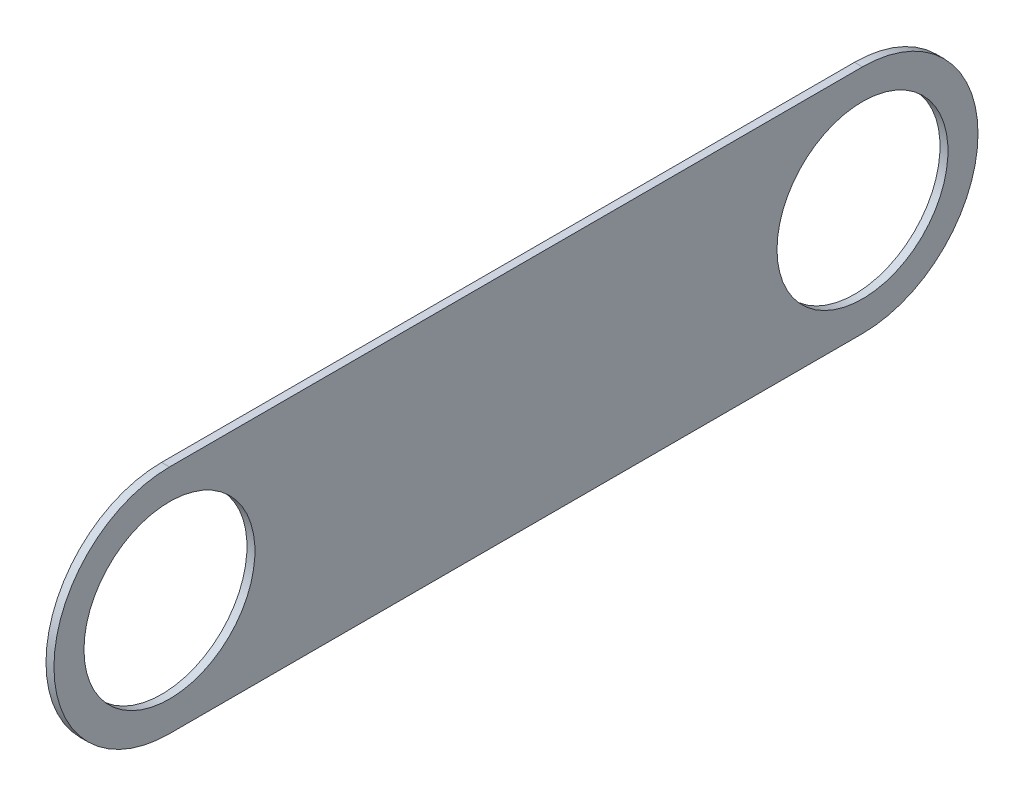
ISO-10303-21;
HEADER;
FILE_DESCRIPTION(('STEP AP214'),'2;1');
FILE_NAME('part.step','',(''),(''),'','','');
FILE_SCHEMA(('AUTOMOTIVE_DESIGN { 1 0 10303 214 1 1 1 1 }'));
ENDSEC;
DATA;
#1=APPLICATION_CONTEXT('core data for automotive mechanical design processes');
#2=APPLICATION_PROTOCOL_DEFINITION('international standard','automotive_design',2000,#1);
#3=PRODUCT_CONTEXT('',#1,'mechanical');
#4=PRODUCT('Part','Part','',(#3));
#5=PRODUCT_RELATED_PRODUCT_CATEGORY('part','',(#4));
#6=PRODUCT_DEFINITION_FORMATION('','',#4);
#7=PRODUCT_DEFINITION_CONTEXT('part definition',#1,'design');
#8=PRODUCT_DEFINITION('design','',#6,#7);
#9=PRODUCT_DEFINITION_SHAPE('','',#8);
#10=(LENGTH_UNIT() NAMED_UNIT(*) SI_UNIT(.MILLI.,.METRE.));
#11=(NAMED_UNIT(*) PLANE_ANGLE_UNIT() SI_UNIT($,.RADIAN.));
#12=(NAMED_UNIT(*) SI_UNIT($,.STERADIAN.) SOLID_ANGLE_UNIT());
#13=UNCERTAINTY_MEASURE_WITH_UNIT(LENGTH_MEASURE(1.E-05),#10,'distance_accuracy_value','');
#14=(GEOMETRIC_REPRESENTATION_CONTEXT(3) GLOBAL_UNCERTAINTY_ASSIGNED_CONTEXT((#13)) GLOBAL_UNIT_ASSIGNED_CONTEXT((#10,
#11,#12)) REPRESENTATION_CONTEXT('',''));
#15=CARTESIAN_POINT('',(0.,0.,0.));
#16=DIRECTION('',(0.,0.,1.));
#17=DIRECTION('',(1.,0.,0.));
#18=AXIS2_PLACEMENT_3D('',#15,#16,#17);
#19=CARTESIAN_POINT('',(0.87376,12.7,0.));
#20=DIRECTION('',(-1.,0.,0.));
#21=DIRECTION('',(0.,0.,1.));
#22=AXIS2_PLACEMENT_3D('',#19,#20,#21);
#23=CYLINDRICAL_SURFACE('',#22,12.7);
#24=CARTESIAN_POINT('',(0.,12.7,0.));
#25=DIRECTION('',(1.,0.,0.));
#26=DIRECTION('',(0.,0.,-1.));
#27=AXIS2_PLACEMENT_3D('',#24,#25,#26);
#28=CIRCLE('',#27,12.7);
#29=CARTESIAN_POINT('',(0.,0.,0.));
#30=VERTEX_POINT('',#29);
#31=CARTESIAN_POINT('',(0.,25.4,0.));
#32=VERTEX_POINT('',#31);
#33=EDGE_CURVE('E114',#30,#32,#28,.T.);
#34=ORIENTED_EDGE('',*,*,#33,.T.);
#35=DIRECTION('',(-1.,0.,0.));
#36=VECTOR('',#35,1.);
#37=CARTESIAN_POINT('',(0.87376,25.4,0.));
#38=LINE('',#37,#36);
#39=CARTESIAN_POINT('',(0.87376,25.4,0.));
#40=VERTEX_POINT('',#39);
#41=EDGE_CURVE('E11',#40,#32,#38,.T.);
#42=ORIENTED_EDGE('',*,*,#41,.F.);
#43=CARTESIAN_POINT('',(0.87376,12.7,0.));
#44=DIRECTION('',(1.,0.,0.));
#45=DIRECTION('',(0.,0.,-1.));
#46=AXIS2_PLACEMENT_3D('',#43,#44,#45);
#47=CIRCLE('',#46,12.7);
#48=CARTESIAN_POINT('',(0.87376,0.,0.));
#49=VERTEX_POINT('',#48);
#50=EDGE_CURVE('E100',#49,#40,#47,.T.);
#51=ORIENTED_EDGE('',*,*,#50,.F.);
#52=DIRECTION('',(-1.,0.,0.));
#53=VECTOR('',#52,1.);
#54=CARTESIAN_POINT('',(0.87376,0.,0.));
#55=LINE('',#54,#53);
#56=EDGE_CURVE('E108',#49,#30,#55,.T.);
#57=ORIENTED_EDGE('',*,*,#56,.T.);
#58=EDGE_LOOP('',(#34,#42,#51,#57));
#59=FACE_BOUND('',#58,.T.);
#60=ADVANCED_FACE('F44',(#59),#23,.T.);
#61=CARTESIAN_POINT('',(0.87376,25.4,76.2));
#62=DIRECTION('',(0.,-1.,0.));
#63=DIRECTION('',(0.,0.,-1.));
#64=AXIS2_PLACEMENT_3D('',#61,#62,#63);
#65=PLANE('',#64);
#66=DIRECTION('',(0.,0.,1.));
#67=VECTOR('',#66,1.);
#68=CARTESIAN_POINT('',(0.,25.4,76.2));
#69=LINE('',#68,#67);
#70=CARTESIAN_POINT('',(0.,25.4,76.2));
#71=VERTEX_POINT('',#70);
#72=EDGE_CURVE('E105',#32,#71,#69,.T.);
#73=ORIENTED_EDGE('',*,*,#72,.T.);
#74=DIRECTION('',(-1.,0.,0.));
#75=VECTOR('',#74,1.);
#76=CARTESIAN_POINT('',(0.87376,25.4,76.2));
#77=LINE('',#76,#75);
#78=CARTESIAN_POINT('',(0.87376,25.4,76.2));
#79=VERTEX_POINT('',#78);
#80=EDGE_CURVE('E53',#79,#71,#77,.T.);
#81=ORIENTED_EDGE('',*,*,#80,.F.);
#82=DIRECTION('',(0.,0.,1.));
#83=VECTOR('',#82,1.);
#84=CARTESIAN_POINT('',(0.87376,25.4,76.2));
#85=LINE('',#84,#83);
#86=EDGE_CURVE('E95',#40,#79,#85,.T.);
#87=ORIENTED_EDGE('',*,*,#86,.F.);
#88=ORIENTED_EDGE('',*,*,#41,.T.);
#89=EDGE_LOOP('',(#73,#81,#87,#88));
#90=FACE_BOUND('',#89,.T.);
#91=ADVANCED_FACE('F101',(#90),#65,.F.);
#92=CARTESIAN_POINT('',(0.87376,12.7,76.2));
#93=DIRECTION('',(-1.,0.,0.));
#94=DIRECTION('',(0.,0.,1.));
#95=AXIS2_PLACEMENT_3D('',#92,#93,#94);
#96=CYLINDRICAL_SURFACE('',#95,12.7);
#97=CARTESIAN_POINT('',(0.,12.7,76.2));
#98=DIRECTION('',(1.,0.,0.));
#99=DIRECTION('',(0.,0.,-1.));
#100=AXIS2_PLACEMENT_3D('',#97,#98,#99);
#101=CIRCLE('',#100,12.7);
#102=CARTESIAN_POINT('',(0.,0.,76.2));
#103=VERTEX_POINT('',#102);
#104=EDGE_CURVE('E76',#71,#103,#101,.T.);
#105=ORIENTED_EDGE('',*,*,#104,.T.);
#106=DIRECTION('',(-1.,0.,0.));
#107=VECTOR('',#106,1.);
#108=CARTESIAN_POINT('',(0.87376,0.,76.2));
#109=LINE('',#108,#107);
#110=CARTESIAN_POINT('',(0.87376,0.,76.2));
#111=VERTEX_POINT('',#110);
#112=EDGE_CURVE('E102',#111,#103,#109,.T.);
#113=ORIENTED_EDGE('',*,*,#112,.F.);
#114=CARTESIAN_POINT('',(0.87376,12.7,76.2));
#115=DIRECTION('',(1.,0.,0.));
#116=DIRECTION('',(0.,0.,-1.));
#117=AXIS2_PLACEMENT_3D('',#114,#115,#116);
#118=CIRCLE('',#117,12.7);
#119=EDGE_CURVE('E92',#79,#111,#118,.T.);
#120=ORIENTED_EDGE('',*,*,#119,.F.);
#121=ORIENTED_EDGE('',*,*,#80,.T.);
#122=EDGE_LOOP('',(#105,#113,#120,#121));
#123=FACE_BOUND('',#122,.T.);
#124=ADVANCED_FACE('F104',(#123),#96,.T.);
#125=CARTESIAN_POINT('',(0.87376,0.,0.));
#126=DIRECTION('',(0.,1.,0.));
#127=DIRECTION('',(0.,0.,1.));
#128=AXIS2_PLACEMENT_3D('',#125,#126,#127);
#129=PLANE('',#128);
#130=DIRECTION('',(0.,0.,-1.));
#131=VECTOR('',#130,1.);
#132=CARTESIAN_POINT('',(0.,0.,0.));
#133=LINE('',#132,#131);
#134=EDGE_CURVE('E81',#103,#30,#133,.T.);
#135=ORIENTED_EDGE('',*,*,#134,.T.);
#136=ORIENTED_EDGE('',*,*,#56,.F.);
#137=DIRECTION('',(0.,0.,-1.));
#138=VECTOR('',#137,1.);
#139=CARTESIAN_POINT('',(0.87376,0.,0.));
#140=LINE('',#139,#138);
#141=EDGE_CURVE('E65',#111,#49,#140,.T.);
#142=ORIENTED_EDGE('',*,*,#141,.F.);
#143=ORIENTED_EDGE('',*,*,#112,.T.);
#144=EDGE_LOOP('',(#135,#136,#142,#143));
#145=FACE_BOUND('',#144,.T.);
#146=ADVANCED_FACE('F130',(#145),#129,.F.);
#147=CARTESIAN_POINT('',(0.87376,12.7,0.));
#148=DIRECTION('',(1.,0.,0.));
#149=DIRECTION('',(0.,0.,-1.));
#150=AXIS2_PLACEMENT_3D('',#147,#148,#149);
#151=PLANE('',#150);
#152=CARTESIAN_POINT('',(0.87376,12.7,76.2));
#153=DIRECTION('',(1.,0.,0.));
#154=DIRECTION('',(0.,0.,-1.));
#155=AXIS2_PLACEMENT_3D('',#152,#153,#154);
#156=CIRCLE('',#155,9.39799999999999);
#157=CARTESIAN_POINT('',(0.87376,12.7,85.598));
#158=VERTEX_POINT('',#157);
#159=EDGE_CURVE('E120',#158,#158,#156,.T.);
#160=ORIENTED_EDGE('',*,*,#159,.F.);
#161=EDGE_LOOP('',(#160));
#162=FACE_BOUND('',#161,.T.);
#163=CARTESIAN_POINT('',(0.87376,12.7,0.));
#164=DIRECTION('',(1.,0.,0.));
#165=DIRECTION('',(0.,0.,-1.));
#166=AXIS2_PLACEMENT_3D('',#163,#164,#165);
#167=CIRCLE('',#166,9.398);
#168=CARTESIAN_POINT('',(0.87376,12.7,9.398));
#169=VERTEX_POINT('',#168);
#170=EDGE_CURVE('E131',#169,#169,#167,.T.);
#171=ORIENTED_EDGE('',*,*,#170,.F.);
#172=EDGE_LOOP('',(#171));
#173=FACE_BOUND('',#172,.T.);
#174=ORIENTED_EDGE('',*,*,#50,.T.);
#175=ORIENTED_EDGE('',*,*,#86,.T.);
#176=ORIENTED_EDGE('',*,*,#119,.T.);
#177=ORIENTED_EDGE('',*,*,#141,.T.);
#178=EDGE_LOOP('',(#174,#175,#176,#177));
#179=FACE_BOUND('',#178,.T.);
#180=ADVANCED_FACE('F91',(#162,#173,#179),#151,.T.);
#181=CARTESIAN_POINT('',(0.,12.7,0.));
#182=DIRECTION('',(1.,0.,0.));
#183=DIRECTION('',(0.,0.,-1.));
#184=AXIS2_PLACEMENT_3D('',#181,#182,#183);
#185=PLANE('',#184);
#186=CARTESIAN_POINT('',(0.,12.7,76.2));
#187=DIRECTION('',(1.,0.,0.));
#188=DIRECTION('',(0.,0.,-1.));
#189=AXIS2_PLACEMENT_3D('',#186,#187,#188);
#190=CIRCLE('',#189,9.39799999999999);
#191=CARTESIAN_POINT('',(0.,12.7,85.598));
#192=VERTEX_POINT('',#191);
#193=EDGE_CURVE('E142',#192,#192,#190,.T.);
#194=ORIENTED_EDGE('',*,*,#193,.T.);
#195=EDGE_LOOP('',(#194));
#196=FACE_BOUND('',#195,.T.);
#197=CARTESIAN_POINT('',(0.,12.7,0.));
#198=DIRECTION('',(1.,0.,0.));
#199=DIRECTION('',(0.,0.,-1.));
#200=AXIS2_PLACEMENT_3D('',#197,#198,#199);
#201=CIRCLE('',#200,9.398);
#202=CARTESIAN_POINT('',(0.,12.7,9.398));
#203=VERTEX_POINT('',#202);
#204=EDGE_CURVE('E138',#203,#203,#201,.T.);
#205=ORIENTED_EDGE('',*,*,#204,.T.);
#206=EDGE_LOOP('',(#205));
#207=FACE_BOUND('',#206,.T.);
#208=ORIENTED_EDGE('',*,*,#33,.F.);
#209=ORIENTED_EDGE('',*,*,#134,.F.);
#210=ORIENTED_EDGE('',*,*,#104,.F.);
#211=ORIENTED_EDGE('',*,*,#72,.F.);
#212=EDGE_LOOP('',(#208,#209,#210,#211));
#213=FACE_BOUND('',#212,.T.);
#214=ADVANCED_FACE('F128',(#196,#207,#213),#185,.F.);
#215=CARTESIAN_POINT('',(0.87376,12.7,0.));
#216=DIRECTION('',(-1.,0.,0.));
#217=DIRECTION('',(0.,0.,1.));
#218=AXIS2_PLACEMENT_3D('',#215,#216,#217);
#219=CYLINDRICAL_SURFACE('',#218,9.398);
#220=CARTESIAN_POINT('',(0.87376,12.7,9.398));
#221=CARTESIAN_POINT('',(0.864658333333333,12.7,9.398));
#222=CARTESIAN_POINT('',(0.855556666666667,12.7,9.398));
#223=CARTESIAN_POINT('',(0.837353333333333,12.7,9.398));
#224=CARTESIAN_POINT('',(0.828251666666667,12.7,9.398));
#225=CARTESIAN_POINT('',(0.810048333333333,12.7,9.398));
#226=CARTESIAN_POINT('',(0.800946666666667,12.7,9.398));
#227=CARTESIAN_POINT('',(0.782743333333333,12.7,9.398));
#228=CARTESIAN_POINT('',(0.773641666666667,12.7,9.398));
#229=CARTESIAN_POINT('',(0.755438333333333,12.7,9.398));
#230=CARTESIAN_POINT('',(0.746336666666667,12.7,9.398));
#231=CARTESIAN_POINT('',(0.728133333333333,12.7,9.398));
#232=CARTESIAN_POINT('',(0.719031666666667,12.7,9.398));
#233=CARTESIAN_POINT('',(0.700828333333333,12.7,9.398));
#234=CARTESIAN_POINT('',(0.691726666666667,12.7,9.398));
#235=CARTESIAN_POINT('',(0.673523333333333,12.7,9.398));
#236=CARTESIAN_POINT('',(0.664421666666667,12.7,9.398));
#237=CARTESIAN_POINT('',(0.646218333333333,12.7,9.398));
#238=CARTESIAN_POINT('',(0.637116666666667,12.7,9.398));
#239=CARTESIAN_POINT('',(0.618913333333333,12.7,9.398));
#240=CARTESIAN_POINT('',(0.609811666666667,12.7,9.398));
#241=CARTESIAN_POINT('',(0.591608333333333,12.7,9.398));
#242=CARTESIAN_POINT('',(0.582506666666667,12.7,9.398));
#243=CARTESIAN_POINT('',(0.564303333333333,12.7,9.398));
#244=CARTESIAN_POINT('',(0.555201666666667,12.7,9.398));
#245=CARTESIAN_POINT('',(0.536998333333333,12.7,9.398));
#246=CARTESIAN_POINT('',(0.527896666666667,12.7,9.398));
#247=CARTESIAN_POINT('',(0.509693333333333,12.7,9.398));
#248=CARTESIAN_POINT('',(0.500591666666667,12.7,9.398));
#249=CARTESIAN_POINT('',(0.482388333333333,12.7,9.398));
#250=CARTESIAN_POINT('',(0.473286666666667,12.7,9.398));
#251=CARTESIAN_POINT('',(0.455083333333333,12.7,9.398));
#252=CARTESIAN_POINT('',(0.445981666666667,12.7,9.398));
#253=CARTESIAN_POINT('',(0.427778333333333,12.7,9.398));
#254=CARTESIAN_POINT('',(0.418676666666667,12.7,9.398));
#255=CARTESIAN_POINT('',(0.400473333333333,12.7,9.398));
#256=CARTESIAN_POINT('',(0.391371666666667,12.7,9.398));
#257=CARTESIAN_POINT('',(0.373168333333333,12.7,9.398));
#258=CARTESIAN_POINT('',(0.364066666666667,12.7,9.398));
#259=CARTESIAN_POINT('',(0.345863333333333,12.7,9.398));
#260=CARTESIAN_POINT('',(0.336761666666667,12.7,9.398));
#261=CARTESIAN_POINT('',(0.318558333333333,12.7,9.398));
#262=CARTESIAN_POINT('',(0.309456666666667,12.7,9.398));
#263=CARTESIAN_POINT('',(0.291253333333333,12.7,9.398));
#264=CARTESIAN_POINT('',(0.282151666666667,12.7,9.398));
#265=CARTESIAN_POINT('',(0.263948333333333,12.7,9.398));
#266=CARTESIAN_POINT('',(0.254846666666667,12.7,9.398));
#267=CARTESIAN_POINT('',(0.236643333333333,12.7,9.398));
#268=CARTESIAN_POINT('',(0.227541666666667,12.7,9.398));
#269=CARTESIAN_POINT('',(0.209338333333333,12.7,9.398));
#270=CARTESIAN_POINT('',(0.200236666666667,12.7,9.398));
#271=CARTESIAN_POINT('',(0.182033333333333,12.7,9.398));
#272=CARTESIAN_POINT('',(0.172931666666667,12.7,9.398));
#273=CARTESIAN_POINT('',(0.154728333333333,12.7,9.398));
#274=CARTESIAN_POINT('',(0.145626666666667,12.7,9.398));
#275=CARTESIAN_POINT('',(0.127423333333333,12.7,9.398));
#276=CARTESIAN_POINT('',(0.118321666666667,12.7,9.398));
#277=CARTESIAN_POINT('',(0.100118333333333,12.7,9.398));
#278=CARTESIAN_POINT('',(0.0910166666666667,12.7,9.398));
#279=CARTESIAN_POINT('',(0.0728133333333333,12.7,9.398));
#280=CARTESIAN_POINT('',(0.0637116666666667,12.7,9.398));
#281=CARTESIAN_POINT('',(0.0455083333333333,12.7,9.398));
#282=CARTESIAN_POINT('',(0.0364066666666667,12.7,9.398));
#283=CARTESIAN_POINT('',(0.0182033333333334,12.7,9.398));
#284=CARTESIAN_POINT('',(0.00910166666666669,12.7,9.398));
#285=CARTESIAN_POINT('',(0.,12.7,9.398));
#286=B_SPLINE_CURVE_WITH_KNOTS('',3,(#220,#221,#222,#223,#224,#225,#226,#227,#228,#229,#230,
#231,#232,#233,#234,#235,#236,#237,#238,#239,#240,#241,#242,#243,#244,#245,#246,#247,#248,#249,
#250,#251,#252,#253,#254,#255,#256,#257,#258,#259,#260,#261,#262,#263,#264,#265,#266,#267,#268,
#269,#270,#271,#272,#273,#274,#275,#276,#277,#278,#279,#280,#281,#282,#283,#284,#285),
.UNSPECIFIED.,.F.,.F.,(4,2,2,2,2,2,2,2,2,2,2,2,2,2,2,2,2,2,2,2,2,2,2,2,2,2,2,2,2,2,2,2,4),(0.,
0.0273049999999999,0.05461,0.0819149999999999,0.10922,0.136525,0.16383,0.191135,0.21844,
0.245745,0.27305,0.300355,0.32766,0.354965,0.38227,0.409575,0.43688,0.464185,0.49149,0.518795,
0.5461,0.573405,0.60071,0.628015,0.65532,0.682625,0.70993,0.737235,0.76454,0.791845,0.81915,
0.846455,0.87376),.UNSPECIFIED.);
#287=EDGE_CURVE('BSEAM158',#169,#203,#286,.T.);
#288=ORIENTED_EDGE('',*,*,#170,.T.);
#289=ORIENTED_EDGE('',*,*,#204,.F.);
#290=ORIENTED_EDGE('',*,*,#287,.T.);
#291=ORIENTED_EDGE('',*,*,#287,.F.);
#292=EDGE_LOOP('',(#288,#290,#289,#291));
#293=FACE_BOUND('',#292,.T.);
#294=ADVANCED_FACE('F158',(#293),#219,.F.);
#295=CARTESIAN_POINT('',(0.87376,12.7,76.2));
#296=DIRECTION('',(-1.,0.,0.));
#297=DIRECTION('',(0.,0.,1.));
#298=AXIS2_PLACEMENT_3D('',#295,#296,#297);
#299=CYLINDRICAL_SURFACE('',#298,9.39799999999999);
#300=CARTESIAN_POINT('',(0.87376,12.7,85.598));
#301=CARTESIAN_POINT('',(0.864658333333333,12.7,85.598));
#302=CARTESIAN_POINT('',(0.855556666666667,12.7,85.598));
#303=CARTESIAN_POINT('',(0.837353333333333,12.7,85.598));
#304=CARTESIAN_POINT('',(0.828251666666667,12.7,85.598));
#305=CARTESIAN_POINT('',(0.810048333333333,12.7,85.598));
#306=CARTESIAN_POINT('',(0.800946666666667,12.7,85.598));
#307=CARTESIAN_POINT('',(0.782743333333333,12.7,85.598));
#308=CARTESIAN_POINT('',(0.773641666666667,12.7,85.598));
#309=CARTESIAN_POINT('',(0.755438333333333,12.7,85.598));
#310=CARTESIAN_POINT('',(0.746336666666667,12.7,85.598));
#311=CARTESIAN_POINT('',(0.728133333333333,12.7,85.598));
#312=CARTESIAN_POINT('',(0.719031666666667,12.7,85.598));
#313=CARTESIAN_POINT('',(0.700828333333333,12.7,85.598));
#314=CARTESIAN_POINT('',(0.691726666666667,12.7,85.598));
#315=CARTESIAN_POINT('',(0.673523333333333,12.7,85.598));
#316=CARTESIAN_POINT('',(0.664421666666667,12.7,85.598));
#317=CARTESIAN_POINT('',(0.646218333333333,12.7,85.598));
#318=CARTESIAN_POINT('',(0.637116666666667,12.7,85.598));
#319=CARTESIAN_POINT('',(0.618913333333333,12.7,85.598));
#320=CARTESIAN_POINT('',(0.609811666666667,12.7,85.598));
#321=CARTESIAN_POINT('',(0.591608333333333,12.7,85.598));
#322=CARTESIAN_POINT('',(0.582506666666667,12.7,85.598));
#323=CARTESIAN_POINT('',(0.564303333333333,12.7,85.598));
#324=CARTESIAN_POINT('',(0.555201666666667,12.7,85.598));
#325=CARTESIAN_POINT('',(0.536998333333333,12.7,85.598));
#326=CARTESIAN_POINT('',(0.527896666666667,12.7,85.598));
#327=CARTESIAN_POINT('',(0.509693333333333,12.7,85.598));
#328=CARTESIAN_POINT('',(0.500591666666667,12.7,85.598));
#329=CARTESIAN_POINT('',(0.482388333333333,12.7,85.598));
#330=CARTESIAN_POINT('',(0.473286666666667,12.7,85.598));
#331=CARTESIAN_POINT('',(0.455083333333333,12.7,85.598));
#332=CARTESIAN_POINT('',(0.445981666666667,12.7,85.598));
#333=CARTESIAN_POINT('',(0.427778333333333,12.7,85.598));
#334=CARTESIAN_POINT('',(0.418676666666667,12.7,85.598));
#335=CARTESIAN_POINT('',(0.400473333333333,12.7,85.598));
#336=CARTESIAN_POINT('',(0.391371666666667,12.7,85.598));
#337=CARTESIAN_POINT('',(0.373168333333333,12.7,85.598));
#338=CARTESIAN_POINT('',(0.364066666666667,12.7,85.598));
#339=CARTESIAN_POINT('',(0.345863333333333,12.7,85.598));
#340=CARTESIAN_POINT('',(0.336761666666667,12.7,85.598));
#341=CARTESIAN_POINT('',(0.318558333333333,12.7,85.598));
#342=CARTESIAN_POINT('',(0.309456666666667,12.7,85.598));
#343=CARTESIAN_POINT('',(0.291253333333333,12.7,85.598));
#344=CARTESIAN_POINT('',(0.282151666666667,12.7,85.598));
#345=CARTESIAN_POINT('',(0.263948333333333,12.7,85.598));
#346=CARTESIAN_POINT('',(0.254846666666667,12.7,85.598));
#347=CARTESIAN_POINT('',(0.236643333333333,12.7,85.598));
#348=CARTESIAN_POINT('',(0.227541666666667,12.7,85.598));
#349=CARTESIAN_POINT('',(0.209338333333333,12.7,85.598));
#350=CARTESIAN_POINT('',(0.200236666666667,12.7,85.598));
#351=CARTESIAN_POINT('',(0.182033333333333,12.7,85.598));
#352=CARTESIAN_POINT('',(0.172931666666667,12.7,85.598));
#353=CARTESIAN_POINT('',(0.154728333333333,12.7,85.598));
#354=CARTESIAN_POINT('',(0.145626666666667,12.7,85.598));
#355=CARTESIAN_POINT('',(0.127423333333333,12.7,85.598));
#356=CARTESIAN_POINT('',(0.118321666666667,12.7,85.598));
#357=CARTESIAN_POINT('',(0.100118333333333,12.7,85.598));
#358=CARTESIAN_POINT('',(0.0910166666666667,12.7,85.598));
#359=CARTESIAN_POINT('',(0.0728133333333333,12.7,85.598));
#360=CARTESIAN_POINT('',(0.0637116666666667,12.7,85.598));
#361=CARTESIAN_POINT('',(0.0455083333333333,12.7,85.598));
#362=CARTESIAN_POINT('',(0.0364066666666667,12.7,85.598));
#363=CARTESIAN_POINT('',(0.0182033333333334,12.7,85.598));
#364=CARTESIAN_POINT('',(0.00910166666666669,12.7,85.598));
#365=CARTESIAN_POINT('',(0.,12.7,85.598));
#366=B_SPLINE_CURVE_WITH_KNOTS('',3,(#300,#301,#302,#303,#304,#305,#306,#307,#308,#309,#310,
#311,#312,#313,#314,#315,#316,#317,#318,#319,#320,#321,#322,#323,#324,#325,#326,#327,#328,#329,
#330,#331,#332,#333,#334,#335,#336,#337,#338,#339,#340,#341,#342,#343,#344,#345,#346,#347,#348,
#349,#350,#351,#352,#353,#354,#355,#356,#357,#358,#359,#360,#361,#362,#363,#364,#365),
.UNSPECIFIED.,.F.,.F.,(4,2,2,2,2,2,2,2,2,2,2,2,2,2,2,2,2,2,2,2,2,2,2,2,2,2,2,2,2,2,2,2,4),(0.,
0.0273049999999999,0.05461,0.0819149999999999,0.10922,0.136525,0.16383,0.191135,0.21844,
0.245745,0.27305,0.300355,0.32766,0.354965,0.38227,0.409575,0.43688,0.464185,0.49149,0.518795,
0.5461,0.573405,0.60071,0.628015,0.65532,0.682625,0.70993,0.737235,0.76454,0.791845,0.81915,
0.846455,0.87376),.UNSPECIFIED.);
#367=EDGE_CURVE('BSEAM147',#158,#192,#366,.T.);
#368=ORIENTED_EDGE('',*,*,#159,.T.);
#369=ORIENTED_EDGE('',*,*,#193,.F.);
#370=ORIENTED_EDGE('',*,*,#367,.T.);
#371=ORIENTED_EDGE('',*,*,#367,.F.);
#372=EDGE_LOOP('',(#368,#370,#369,#371));
#373=FACE_BOUND('',#372,.T.);
#374=ADVANCED_FACE('F147',(#373),#299,.F.);
#375=CLOSED_SHELL('',(#60,#91,#124,#146,#180,#214,#294,#374));
#376=MANIFOLD_SOLID_BREP('B2',#375);
#377=ADVANCED_BREP_SHAPE_REPRESENTATION('',(#18,#376),#14);
#378=SHAPE_DEFINITION_REPRESENTATION(#9,#377);
ENDSEC;
END-ISO-10303-21;
